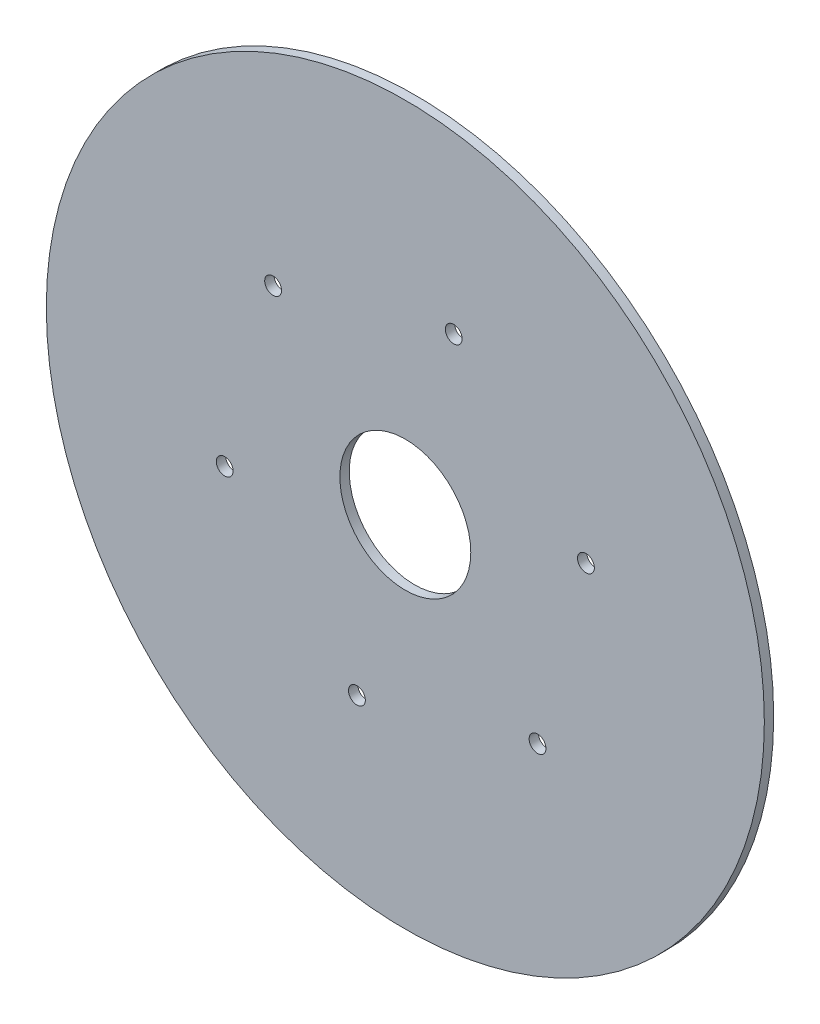
ISO-10303-21;
HEADER;
FILE_DESCRIPTION(('STEP AP214'),'2;1');
FILE_NAME('part.step','',(''),(''),'','','');
FILE_SCHEMA(('AUTOMOTIVE_DESIGN { 1 0 10303 214 1 1 1 1 }'));
ENDSEC;
DATA;
#1=APPLICATION_CONTEXT('core data for automotive mechanical design processes');
#2=APPLICATION_PROTOCOL_DEFINITION('international standard','automotive_design',2000,#1);
#3=PRODUCT_CONTEXT('',#1,'mechanical');
#4=PRODUCT('Part','Part','',(#3));
#5=PRODUCT_RELATED_PRODUCT_CATEGORY('part','',(#4));
#6=PRODUCT_DEFINITION_FORMATION('','',#4);
#7=PRODUCT_DEFINITION_CONTEXT('part definition',#1,'design');
#8=PRODUCT_DEFINITION('design','',#6,#7);
#9=PRODUCT_DEFINITION_SHAPE('','',#8);
#10=(LENGTH_UNIT() NAMED_UNIT(*) SI_UNIT(.MILLI.,.METRE.));
#11=(NAMED_UNIT(*) PLANE_ANGLE_UNIT() SI_UNIT($,.RADIAN.));
#12=(NAMED_UNIT(*) SI_UNIT($,.STERADIAN.) SOLID_ANGLE_UNIT());
#13=UNCERTAINTY_MEASURE_WITH_UNIT(LENGTH_MEASURE(1.E-05),#10,'distance_accuracy_value','');
#14=(GEOMETRIC_REPRESENTATION_CONTEXT(3) GLOBAL_UNCERTAINTY_ASSIGNED_CONTEXT((#13)) GLOBAL_UNIT_ASSIGNED_CONTEXT((#10,
#11,#12)) REPRESENTATION_CONTEXT('',''));
#15=CARTESIAN_POINT('',(0.,0.,0.));
#16=DIRECTION('',(0.,0.,1.));
#17=DIRECTION('',(1.,0.,0.));
#18=AXIS2_PLACEMENT_3D('',#15,#16,#17);
#19=CARTESIAN_POINT('',(0.,0.,61.));
#20=DIRECTION('',(0.,0.,1.));
#21=DIRECTION('',(1.,0.,0.));
#22=AXIS2_PLACEMENT_3D('',#19,#20,#21);
#23=PLANE('',#22);
#24=CARTESIAN_POINT('',(48.2962913144534,12.940952255126,61.));
#25=DIRECTION('',(0.,0.,1.));
#26=DIRECTION('',(1.,0.,0.));
#27=AXIS2_PLACEMENT_3D('',#24,#25,#26);
#28=CIRCLE('',#27,2.25);
#29=CARTESIAN_POINT('',(50.5462913144534,12.940952255126,61.));
#30=VERTEX_POINT('',#29);
#31=EDGE_CURVE('E94',#30,#30,#28,.T.);
#32=ORIENTED_EDGE('',*,*,#31,.F.);
#33=EDGE_LOOP('',(#32));
#34=FACE_BOUND('',#33,.T.);
#35=CARTESIAN_POINT('',(12.940952255126,48.2962913144534,61.));
#36=DIRECTION('',(0.,0.,1.));
#37=DIRECTION('',(1.,0.,0.));
#38=AXIS2_PLACEMENT_3D('',#35,#36,#37);
#39=CIRCLE('',#38,2.25);
#40=CARTESIAN_POINT('',(15.190952255126,48.2962913144534,61.));
#41=VERTEX_POINT('',#40);
#42=EDGE_CURVE('E80',#41,#41,#39,.T.);
#43=ORIENTED_EDGE('',*,*,#42,.F.);
#44=EDGE_LOOP('',(#43));
#45=FACE_BOUND('',#44,.T.);
#46=CARTESIAN_POINT('',(-35.3553390593274,35.3553390593274,61.));
#47=DIRECTION('',(0.,0.,1.));
#48=DIRECTION('',(1.,0.,0.));
#49=AXIS2_PLACEMENT_3D('',#46,#47,#48);
#50=CIRCLE('',#49,2.25);
#51=CARTESIAN_POINT('',(-33.1053390593274,35.3553390593274,61.));
#52=VERTEX_POINT('',#51);
#53=EDGE_CURVE('E76',#52,#52,#50,.T.);
#54=ORIENTED_EDGE('',*,*,#53,.F.);
#55=EDGE_LOOP('',(#54));
#56=FACE_BOUND('',#55,.T.);
#57=CARTESIAN_POINT('',(-48.2962913144534,-12.940952255126,61.));
#58=DIRECTION('',(0.,0.,1.));
#59=DIRECTION('',(1.,0.,0.));
#60=AXIS2_PLACEMENT_3D('',#57,#58,#59);
#61=CIRCLE('',#60,2.25);
#62=CARTESIAN_POINT('',(-46.0462913144534,-12.940952255126,61.));
#63=VERTEX_POINT('',#62);
#64=EDGE_CURVE('E72',#63,#63,#61,.T.);
#65=ORIENTED_EDGE('',*,*,#64,.F.);
#66=EDGE_LOOP('',(#65));
#67=FACE_BOUND('',#66,.T.);
#68=CARTESIAN_POINT('',(-12.9409522551261,-48.2962913144534,61.));
#69=DIRECTION('',(0.,0.,1.));
#70=DIRECTION('',(1.,0.,0.));
#71=AXIS2_PLACEMENT_3D('',#68,#69,#70);
#72=CIRCLE('',#71,2.25);
#73=CARTESIAN_POINT('',(-10.6909522551261,-48.2962913144534,61.));
#74=VERTEX_POINT('',#73);
#75=EDGE_CURVE('E67',#74,#74,#72,.T.);
#76=ORIENTED_EDGE('',*,*,#75,.F.);
#77=EDGE_LOOP('',(#76));
#78=FACE_BOUND('',#77,.T.);
#79=CARTESIAN_POINT('',(35.3553390593274,-35.3553390593274,61.));
#80=DIRECTION('',(0.,0.,1.));
#81=DIRECTION('',(1.,0.,0.));
#82=AXIS2_PLACEMENT_3D('',#79,#80,#81);
#83=CIRCLE('',#82,2.25);
#84=CARTESIAN_POINT('',(37.6053390593274,-35.3553390593274,61.));
#85=VERTEX_POINT('',#84);
#86=EDGE_CURVE('E62',#85,#85,#83,.T.);
#87=ORIENTED_EDGE('',*,*,#86,.F.);
#88=EDGE_LOOP('',(#87));
#89=FACE_BOUND('',#88,.T.);
#90=CARTESIAN_POINT('',(0.,0.,61.));
#91=DIRECTION('',(0.,0.,1.));
#92=DIRECTION('',(1.,0.,0.));
#93=AXIS2_PLACEMENT_3D('',#90,#91,#92);
#94=CIRCLE('',#93,96.);
#95=CARTESIAN_POINT('',(96.,0.,61.));
#96=VERTEX_POINT('',#95);
#97=EDGE_CURVE('E10',#96,#96,#94,.T.);
#98=ORIENTED_EDGE('',*,*,#97,.T.);
#99=EDGE_LOOP('',(#98));
#100=FACE_BOUND('',#99,.T.);
#101=CARTESIAN_POINT('',(0.,0.,61.));
#102=DIRECTION('',(0.,0.,1.));
#103=DIRECTION('',(1.,0.,0.));
#104=AXIS2_PLACEMENT_3D('',#101,#102,#103);
#105=CIRCLE('',#104,17.5);
#106=CARTESIAN_POINT('',(17.5,0.,61.));
#107=VERTEX_POINT('',#106);
#108=EDGE_CURVE('E52',#107,#107,#105,.T.);
#109=ORIENTED_EDGE('',*,*,#108,.F.);
#110=EDGE_LOOP('',(#109));
#111=FACE_BOUND('',#110,.T.);
#112=ADVANCED_FACE('F36',(#34,#45,#56,#67,#78,#89,#100,#111),#23,.T.);
#113=CARTESIAN_POINT('',(0.,0.,58.5));
#114=DIRECTION('',(0.,0.,1.));
#115=DIRECTION('',(1.,0.,0.));
#116=AXIS2_PLACEMENT_3D('',#113,#114,#115);
#117=PLANE('',#116);
#118=CARTESIAN_POINT('',(48.2962913144534,12.940952255126,58.5));
#119=DIRECTION('',(0.,0.,1.));
#120=DIRECTION('',(1.,0.,0.));
#121=AXIS2_PLACEMENT_3D('',#118,#119,#120);
#122=CIRCLE('',#121,2.25);
#123=CARTESIAN_POINT('',(50.5462913144534,12.940952255126,58.5));
#124=VERTEX_POINT('',#123);
#125=EDGE_CURVE('E40',#124,#124,#122,.T.);
#126=ORIENTED_EDGE('',*,*,#125,.T.);
#127=EDGE_LOOP('',(#126));
#128=FACE_BOUND('',#127,.T.);
#129=CARTESIAN_POINT('',(12.940952255126,48.2962913144534,58.5));
#130=DIRECTION('',(0.,0.,1.));
#131=DIRECTION('',(1.,0.,0.));
#132=AXIS2_PLACEMENT_3D('',#129,#130,#131);
#133=CIRCLE('',#132,2.25);
#134=CARTESIAN_POINT('',(15.190952255126,48.2962913144534,58.5));
#135=VERTEX_POINT('',#134);
#136=EDGE_CURVE('E77',#135,#135,#133,.T.);
#137=ORIENTED_EDGE('',*,*,#136,.T.);
#138=EDGE_LOOP('',(#137));
#139=FACE_BOUND('',#138,.T.);
#140=CARTESIAN_POINT('',(-35.3553390593274,35.3553390593274,58.5));
#141=DIRECTION('',(0.,0.,1.));
#142=DIRECTION('',(1.,0.,0.));
#143=AXIS2_PLACEMENT_3D('',#140,#141,#142);
#144=CIRCLE('',#143,2.25);
#145=CARTESIAN_POINT('',(-33.1053390593274,35.3553390593274,58.5));
#146=VERTEX_POINT('',#145);
#147=EDGE_CURVE('E73',#146,#146,#144,.T.);
#148=ORIENTED_EDGE('',*,*,#147,.T.);
#149=EDGE_LOOP('',(#148));
#150=FACE_BOUND('',#149,.T.);
#151=CARTESIAN_POINT('',(-48.2962913144534,-12.940952255126,58.5));
#152=DIRECTION('',(0.,0.,1.));
#153=DIRECTION('',(1.,0.,0.));
#154=AXIS2_PLACEMENT_3D('',#151,#152,#153);
#155=CIRCLE('',#154,2.25);
#156=CARTESIAN_POINT('',(-46.0462913144534,-12.940952255126,58.5));
#157=VERTEX_POINT('',#156);
#158=EDGE_CURVE('E68',#157,#157,#155,.T.);
#159=ORIENTED_EDGE('',*,*,#158,.T.);
#160=EDGE_LOOP('',(#159));
#161=FACE_BOUND('',#160,.T.);
#162=CARTESIAN_POINT('',(-12.9409522551261,-48.2962913144534,58.5));
#163=DIRECTION('',(0.,0.,1.));
#164=DIRECTION('',(1.,0.,0.));
#165=AXIS2_PLACEMENT_3D('',#162,#163,#164);
#166=CIRCLE('',#165,2.25);
#167=CARTESIAN_POINT('',(-10.6909522551261,-48.2962913144534,58.5));
#168=VERTEX_POINT('',#167);
#169=EDGE_CURVE('E63',#168,#168,#166,.T.);
#170=ORIENTED_EDGE('',*,*,#169,.T.);
#171=EDGE_LOOP('',(#170));
#172=FACE_BOUND('',#171,.T.);
#173=CARTESIAN_POINT('',(35.3553390593274,-35.3553390593274,58.5));
#174=DIRECTION('',(0.,0.,1.));
#175=DIRECTION('',(1.,0.,0.));
#176=AXIS2_PLACEMENT_3D('',#173,#174,#175);
#177=CIRCLE('',#176,2.25);
#178=CARTESIAN_POINT('',(37.6053390593274,-35.3553390593274,58.5));
#179=VERTEX_POINT('',#178);
#180=EDGE_CURVE('E58',#179,#179,#177,.T.);
#181=ORIENTED_EDGE('',*,*,#180,.T.);
#182=EDGE_LOOP('',(#181));
#183=FACE_BOUND('',#182,.T.);
#184=CARTESIAN_POINT('',(0.,0.,58.5));
#185=DIRECTION('',(0.,0.,1.));
#186=DIRECTION('',(1.,0.,0.));
#187=AXIS2_PLACEMENT_3D('',#184,#185,#186);
#188=CIRCLE('',#187,96.);
#189=CARTESIAN_POINT('',(96.,0.,58.5));
#190=VERTEX_POINT('',#189);
#191=EDGE_CURVE('E45',#190,#190,#188,.T.);
#192=ORIENTED_EDGE('',*,*,#191,.F.);
#193=EDGE_LOOP('',(#192));
#194=FACE_BOUND('',#193,.T.);
#195=CARTESIAN_POINT('',(0.,0.,58.5));
#196=DIRECTION('',(0.,0.,1.));
#197=DIRECTION('',(1.,0.,0.));
#198=AXIS2_PLACEMENT_3D('',#195,#196,#197);
#199=CIRCLE('',#198,17.5);
#200=CARTESIAN_POINT('',(17.5,0.,58.5));
#201=VERTEX_POINT('',#200);
#202=EDGE_CURVE('E55',#201,#201,#199,.T.);
#203=ORIENTED_EDGE('',*,*,#202,.T.);
#204=EDGE_LOOP('',(#203));
#205=FACE_BOUND('',#204,.T.);
#206=ADVANCED_FACE('F106',(#128,#139,#150,#161,#172,#183,#194,#205),#117,.F.);
#207=CARTESIAN_POINT('',(0.,0.,61.));
#208=DIRECTION('',(0.,0.,-1.));
#209=DIRECTION('',(-1.,0.,0.));
#210=AXIS2_PLACEMENT_3D('',#207,#208,#209);
#211=CYLINDRICAL_SURFACE('',#210,96.);
#212=ORIENTED_EDGE('',*,*,#97,.F.);
#213=EDGE_LOOP('',(#212));
#214=FACE_BOUND('',#213,.T.);
#215=ORIENTED_EDGE('',*,*,#191,.T.);
#216=EDGE_LOOP('',(#215));
#217=FACE_BOUND('',#216,.T.);
#218=ADVANCED_FACE('F38',(#214,#217),#211,.T.);
#219=CARTESIAN_POINT('',(0.,0.,61.));
#220=DIRECTION('',(0.,0.,-1.));
#221=DIRECTION('',(-1.,0.,0.));
#222=AXIS2_PLACEMENT_3D('',#219,#220,#221);
#223=CYLINDRICAL_SURFACE('',#222,17.5);
#224=ORIENTED_EDGE('',*,*,#108,.T.);
#225=EDGE_LOOP('',(#224));
#226=FACE_BOUND('',#225,.T.);
#227=ORIENTED_EDGE('',*,*,#202,.F.);
#228=EDGE_LOOP('',(#227));
#229=FACE_BOUND('',#228,.T.);
#230=ADVANCED_FACE('F108',(#226,#229),#223,.F.);
#231=CARTESIAN_POINT('',(35.3553390593274,-35.3553390593274,-100.));
#232=DIRECTION('',(0.,0.,1.));
#233=DIRECTION('',(1.,0.,0.));
#234=AXIS2_PLACEMENT_3D('',#231,#232,#233);
#235=CYLINDRICAL_SURFACE('',#234,2.25);
#236=ORIENTED_EDGE('',*,*,#86,.T.);
#237=EDGE_LOOP('',(#236));
#238=FACE_BOUND('',#237,.T.);
#239=ORIENTED_EDGE('',*,*,#180,.F.);
#240=EDGE_LOOP('',(#239));
#241=FACE_BOUND('',#240,.T.);
#242=ADVANCED_FACE('F110',(#238,#241),#235,.F.);
#243=CARTESIAN_POINT('',(-12.9409522551261,-48.2962913144534,-100.));
#244=DIRECTION('',(0.,0.,1.));
#245=DIRECTION('',(1.,0.,0.));
#246=AXIS2_PLACEMENT_3D('',#243,#244,#245);
#247=CYLINDRICAL_SURFACE('',#246,2.25);
#248=ORIENTED_EDGE('',*,*,#75,.T.);
#249=EDGE_LOOP('',(#248));
#250=FACE_BOUND('',#249,.T.);
#251=ORIENTED_EDGE('',*,*,#169,.F.);
#252=EDGE_LOOP('',(#251));
#253=FACE_BOUND('',#252,.T.);
#254=ADVANCED_FACE('F116',(#250,#253),#247,.F.);
#255=CARTESIAN_POINT('',(-48.2962913144534,-12.940952255126,-100.));
#256=DIRECTION('',(0.,0.,1.));
#257=DIRECTION('',(1.,0.,0.));
#258=AXIS2_PLACEMENT_3D('',#255,#256,#257);
#259=CYLINDRICAL_SURFACE('',#258,2.25);
#260=ORIENTED_EDGE('',*,*,#64,.T.);
#261=EDGE_LOOP('',(#260));
#262=FACE_BOUND('',#261,.T.);
#263=ORIENTED_EDGE('',*,*,#158,.F.);
#264=EDGE_LOOP('',(#263));
#265=FACE_BOUND('',#264,.T.);
#266=ADVANCED_FACE('F147',(#262,#265),#259,.F.);
#267=CARTESIAN_POINT('',(-35.3553390593274,35.3553390593274,-100.));
#268=DIRECTION('',(0.,0.,1.));
#269=DIRECTION('',(1.,0.,0.));
#270=AXIS2_PLACEMENT_3D('',#267,#268,#269);
#271=CYLINDRICAL_SURFACE('',#270,2.25);
#272=ORIENTED_EDGE('',*,*,#53,.T.);
#273=EDGE_LOOP('',(#272));
#274=FACE_BOUND('',#273,.T.);
#275=ORIENTED_EDGE('',*,*,#147,.F.);
#276=EDGE_LOOP('',(#275));
#277=FACE_BOUND('',#276,.T.);
#278=ADVANCED_FACE('F160',(#274,#277),#271,.F.);
#279=CARTESIAN_POINT('',(12.940952255126,48.2962913144534,-100.));
#280=DIRECTION('',(0.,0.,1.));
#281=DIRECTION('',(1.,0.,0.));
#282=AXIS2_PLACEMENT_3D('',#279,#280,#281);
#283=CYLINDRICAL_SURFACE('',#282,2.25);
#284=ORIENTED_EDGE('',*,*,#42,.T.);
#285=EDGE_LOOP('',(#284));
#286=FACE_BOUND('',#285,.T.);
#287=ORIENTED_EDGE('',*,*,#136,.F.);
#288=EDGE_LOOP('',(#287));
#289=FACE_BOUND('',#288,.T.);
#290=ADVANCED_FACE('F166',(#286,#289),#283,.F.);
#291=CARTESIAN_POINT('',(48.2962913144534,12.940952255126,-100.));
#292=DIRECTION('',(0.,0.,1.));
#293=DIRECTION('',(1.,0.,0.));
#294=AXIS2_PLACEMENT_3D('',#291,#292,#293);
#295=CYLINDRICAL_SURFACE('',#294,2.25);
#296=ORIENTED_EDGE('',*,*,#31,.T.);
#297=EDGE_LOOP('',(#296));
#298=FACE_BOUND('',#297,.T.);
#299=ORIENTED_EDGE('',*,*,#125,.F.);
#300=EDGE_LOOP('',(#299));
#301=FACE_BOUND('',#300,.T.);
#302=ADVANCED_FACE('F169',(#298,#301),#295,.F.);
#303=CLOSED_SHELL('',(#112,#206,#218,#230,#242,#254,#266,#278,#290,#302));
#304=MANIFOLD_SOLID_BREP('B2',#303);
#305=ADVANCED_BREP_SHAPE_REPRESENTATION('',(#18,#304),#14);
#306=SHAPE_DEFINITION_REPRESENTATION(#9,#305);
ENDSEC;
END-ISO-10303-21;
